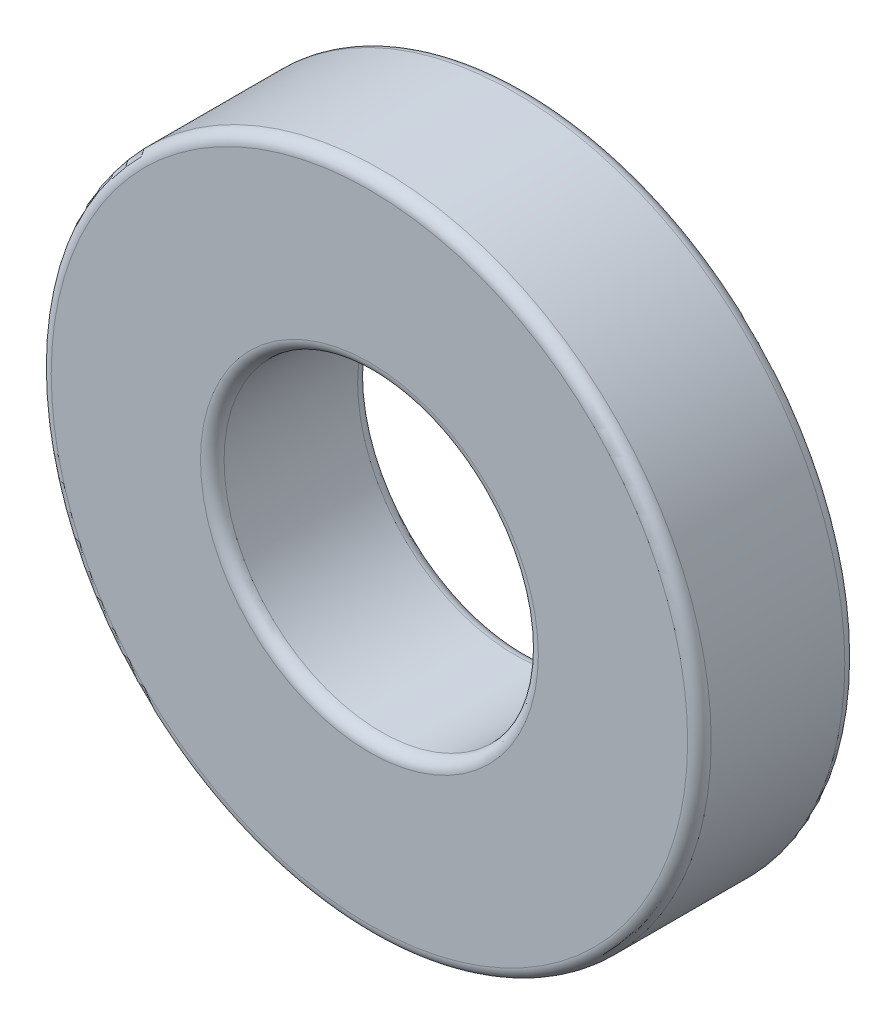
ISO-10303-21;
HEADER;
FILE_DESCRIPTION(('STEP AP214'),'2;1');
FILE_NAME('part.step','',(''),(''),'','','');
FILE_SCHEMA(('AUTOMOTIVE_DESIGN { 1 0 10303 214 1 1 1 1 }'));
ENDSEC;
DATA;
#1=APPLICATION_CONTEXT('core data for automotive mechanical design processes');
#2=APPLICATION_PROTOCOL_DEFINITION('international standard','automotive_design',2000,#1);
#3=PRODUCT_CONTEXT('',#1,'mechanical');
#4=PRODUCT('Part','Part','',(#3));
#5=PRODUCT_RELATED_PRODUCT_CATEGORY('part','',(#4));
#6=PRODUCT_DEFINITION_FORMATION('','',#4);
#7=PRODUCT_DEFINITION_CONTEXT('part definition',#1,'design');
#8=PRODUCT_DEFINITION('design','',#6,#7);
#9=PRODUCT_DEFINITION_SHAPE('','',#8);
#10=(LENGTH_UNIT() NAMED_UNIT(*) SI_UNIT(.MILLI.,.METRE.));
#11=(NAMED_UNIT(*) PLANE_ANGLE_UNIT() SI_UNIT($,.RADIAN.));
#12=(NAMED_UNIT(*) SI_UNIT($,.STERADIAN.) SOLID_ANGLE_UNIT());
#13=UNCERTAINTY_MEASURE_WITH_UNIT(LENGTH_MEASURE(1.E-05),#10,'distance_accuracy_value','');
#14=(GEOMETRIC_REPRESENTATION_CONTEXT(3) GLOBAL_UNCERTAINTY_ASSIGNED_CONTEXT((#13)) GLOBAL_UNIT_ASSIGNED_CONTEXT((#10,
#11,#12)) REPRESENTATION_CONTEXT('',''));
#15=CARTESIAN_POINT('',(0.,0.,0.));
#16=DIRECTION('',(0.,0.,1.));
#17=DIRECTION('',(1.,0.,0.));
#18=AXIS2_PLACEMENT_3D('',#15,#16,#17);
#19=CARTESIAN_POINT('',(0.,0.,10.));
#20=DIRECTION('',(0.,0.,1.));
#21=DIRECTION('',(1.,0.,0.));
#22=AXIS2_PLACEMENT_3D('',#19,#20,#21);
#23=PLANE('',#22);
#24=CARTESIAN_POINT('',(0.,0.,10.));
#25=DIRECTION('',(0.,0.,1.));
#26=DIRECTION('',(1.,0.,0.));
#27=AXIS2_PLACEMENT_3D('',#24,#25,#26);
#28=CIRCLE('',#27,10.75);
#29=CARTESIAN_POINT('',(10.75,0.,10.));
#30=VERTEX_POINT('',#29);
#31=EDGE_CURVE('E53',#30,#30,#28,.F.);
#32=ORIENTED_EDGE('',*,*,#31,.T.);
#33=EDGE_LOOP('',(#32));
#34=FACE_BOUND('',#33,.T.);
#35=CARTESIAN_POINT('',(0.,0.,10.));
#36=DIRECTION('',(0.,0.,1.));
#37=DIRECTION('',(1.,0.,0.));
#38=AXIS2_PLACEMENT_3D('',#35,#36,#37);
#39=CIRCLE('',#38,20.25);
#40=CARTESIAN_POINT('',(20.25,0.,10.));
#41=VERTEX_POINT('',#40);
#42=EDGE_CURVE('E56',#41,#41,#39,.T.);
#43=ORIENTED_EDGE('',*,*,#42,.T.);
#44=EDGE_LOOP('',(#43));
#45=FACE_BOUND('',#44,.T.);
#46=ADVANCED_FACE('F33',(#34,#45),#23,.T.);
#47=CARTESIAN_POINT('',(0.,0.,0.));
#48=DIRECTION('',(0.,0.,1.));
#49=DIRECTION('',(1.,0.,0.));
#50=AXIS2_PLACEMENT_3D('',#47,#48,#49);
#51=PLANE('',#50);
#52=CARTESIAN_POINT('',(0.,0.,0.));
#53=DIRECTION('',(0.,0.,1.));
#54=DIRECTION('',(1.,0.,0.));
#55=AXIS2_PLACEMENT_3D('',#52,#53,#54);
#56=CIRCLE('',#55,10.75);
#57=CARTESIAN_POINT('',(10.75,0.,0.));
#58=VERTEX_POINT('',#57);
#59=EDGE_CURVE('E10',#58,#58,#56,.T.);
#60=ORIENTED_EDGE('',*,*,#59,.T.);
#61=EDGE_LOOP('',(#60));
#62=FACE_BOUND('',#61,.T.);
#63=CARTESIAN_POINT('',(0.,0.,0.));
#64=DIRECTION('',(0.,0.,1.));
#65=DIRECTION('',(1.,0.,0.));
#66=AXIS2_PLACEMENT_3D('',#63,#64,#65);
#67=CIRCLE('',#66,20.25);
#68=CARTESIAN_POINT('',(20.25,0.,0.));
#69=VERTEX_POINT('',#68);
#70=EDGE_CURVE('E40',#69,#69,#67,.F.);
#71=ORIENTED_EDGE('',*,*,#70,.T.);
#72=EDGE_LOOP('',(#71));
#73=FACE_BOUND('',#72,.T.);
#74=ADVANCED_FACE('F81',(#62,#73),#51,.F.);
#75=CARTESIAN_POINT('',(0.,0.,10.));
#76=DIRECTION('',(0.,0.,-1.));
#77=DIRECTION('',(-1.,0.,0.));
#78=AXIS2_PLACEMENT_3D('',#75,#76,#77);
#79=CYLINDRICAL_SURFACE('',#78,21.);
#80=CARTESIAN_POINT('',(0.,0.,9.25));
#81=DIRECTION('',(0.,0.,1.));
#82=DIRECTION('',(1.,0.,0.));
#83=AXIS2_PLACEMENT_3D('',#80,#81,#82);
#84=CIRCLE('',#83,21.);
#85=CARTESIAN_POINT('',(21.,0.,9.25));
#86=VERTEX_POINT('',#85);
#87=EDGE_CURVE('E44',#86,#86,#84,.F.);
#88=ORIENTED_EDGE('',*,*,#87,.T.);
#89=EDGE_LOOP('',(#88));
#90=FACE_BOUND('',#89,.T.);
#91=CARTESIAN_POINT('',(0.,0.,0.750000000000001));
#92=DIRECTION('',(0.,0.,1.));
#93=DIRECTION('',(1.,0.,0.));
#94=AXIS2_PLACEMENT_3D('',#91,#92,#93);
#95=CIRCLE('',#94,21.);
#96=CARTESIAN_POINT('',(21.,0.,0.750000000000001));
#97=VERTEX_POINT('',#96);
#98=EDGE_CURVE('E48',#97,#97,#95,.T.);
#99=ORIENTED_EDGE('',*,*,#98,.T.);
#100=EDGE_LOOP('',(#99));
#101=FACE_BOUND('',#100,.T.);
#102=ADVANCED_FACE('F87',(#90,#101),#79,.T.);
#103=CARTESIAN_POINT('',(0.,0.,10.));
#104=DIRECTION('',(0.,0.,-1.));
#105=DIRECTION('',(-1.,0.,0.));
#106=AXIS2_PLACEMENT_3D('',#103,#104,#105);
#107=CYLINDRICAL_SURFACE('',#106,10.);
#108=CARTESIAN_POINT('',(0.,0.,9.25));
#109=DIRECTION('',(0.,0.,1.));
#110=DIRECTION('',(1.,0.,0.));
#111=AXIS2_PLACEMENT_3D('',#108,#109,#110);
#112=CIRCLE('',#111,10.);
#113=CARTESIAN_POINT('',(10.,0.,9.25));
#114=VERTEX_POINT('',#113);
#115=EDGE_CURVE('E59',#114,#114,#112,.T.);
#116=ORIENTED_EDGE('',*,*,#115,.T.);
#117=EDGE_LOOP('',(#116));
#118=FACE_BOUND('',#117,.T.);
#119=CARTESIAN_POINT('',(0.,0.,0.750000000000001));
#120=DIRECTION('',(0.,0.,1.));
#121=DIRECTION('',(1.,0.,0.));
#122=AXIS2_PLACEMENT_3D('',#119,#120,#121);
#123=CIRCLE('',#122,10.);
#124=CARTESIAN_POINT('',(10.,0.,0.750000000000001));
#125=VERTEX_POINT('',#124);
#126=EDGE_CURVE('E62',#125,#125,#123,.F.);
#127=ORIENTED_EDGE('',*,*,#126,.T.);
#128=EDGE_LOOP('',(#127));
#129=FACE_BOUND('',#128,.T.);
#130=ADVANCED_FACE('F66',(#118,#129),#107,.F.);
#131=CARTESIAN_POINT('',(0.,0.,9.25));
#132=DIRECTION('',(0.,0.,1.));
#133=DIRECTION('',(1.,0.,0.));
#134=AXIS2_PLACEMENT_3D('',#131,#132,#133);
#135=TOROIDAL_SURFACE('',#134,10.75,0.75);
#136=ORIENTED_EDGE('',*,*,#31,.F.);
#137=EDGE_LOOP('',(#136));
#138=FACE_BOUND('',#137,.T.);
#139=ORIENTED_EDGE('',*,*,#115,.F.);
#140=EDGE_LOOP('',(#139));
#141=FACE_BOUND('',#140,.T.);
#142=ADVANCED_FACE('F77',(#138,#141),#135,.T.);
#143=CARTESIAN_POINT('',(0.,0.,9.25));
#144=DIRECTION('',(0.,0.,1.));
#145=DIRECTION('',(1.,0.,0.));
#146=AXIS2_PLACEMENT_3D('',#143,#144,#145);
#147=TOROIDAL_SURFACE('',#146,20.25,0.75);
#148=ORIENTED_EDGE('',*,*,#87,.F.);
#149=EDGE_LOOP('',(#148));
#150=FACE_BOUND('',#149,.T.);
#151=ORIENTED_EDGE('',*,*,#42,.F.);
#152=EDGE_LOOP('',(#151));
#153=FACE_BOUND('',#152,.T.);
#154=ADVANCED_FACE('F71',(#150,#153),#147,.T.);
#155=CARTESIAN_POINT('',(0.,0.,0.750000000000001));
#156=DIRECTION('',(0.,0.,1.));
#157=DIRECTION('',(1.,0.,0.));
#158=AXIS2_PLACEMENT_3D('',#155,#156,#157);
#159=TOROIDAL_SURFACE('',#158,10.75,0.75);
#160=ORIENTED_EDGE('',*,*,#126,.F.);
#161=EDGE_LOOP('',(#160));
#162=FACE_BOUND('',#161,.T.);
#163=ORIENTED_EDGE('',*,*,#59,.F.);
#164=EDGE_LOOP('',(#163));
#165=FACE_BOUND('',#164,.T.);
#166=ADVANCED_FACE('F68',(#162,#165),#159,.T.);
#167=CARTESIAN_POINT('',(0.,0.,0.750000000000001));
#168=DIRECTION('',(0.,0.,1.));
#169=DIRECTION('',(1.,0.,0.));
#170=AXIS2_PLACEMENT_3D('',#167,#168,#169);
#171=TOROIDAL_SURFACE('',#170,20.25,0.75);
#172=ORIENTED_EDGE('',*,*,#70,.F.);
#173=EDGE_LOOP('',(#172));
#174=FACE_BOUND('',#173,.T.);
#175=ORIENTED_EDGE('',*,*,#98,.F.);
#176=EDGE_LOOP('',(#175));
#177=FACE_BOUND('',#176,.T.);
#178=ADVANCED_FACE('F35',(#174,#177),#171,.T.);
#179=CLOSED_SHELL('',(#46,#74,#102,#130,#142,#154,#166,#178));
#180=MANIFOLD_SOLID_BREP('B2',#179);
#181=ADVANCED_BREP_SHAPE_REPRESENTATION('',(#18,#180),#14);
#182=SHAPE_DEFINITION_REPRESENTATION(#9,#181);
ENDSEC;
END-ISO-10303-21;
